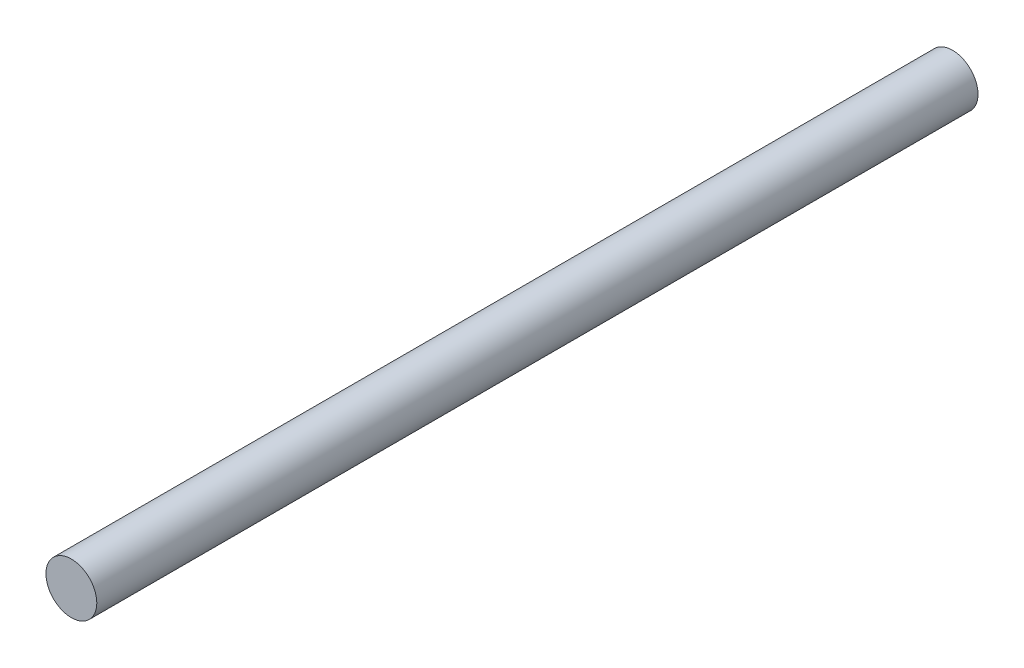
ISO-10303-21;
HEADER;
FILE_DESCRIPTION(('STEP AP214'),'2;1');
FILE_NAME('part.step','',(''),(''),'','','');
FILE_SCHEMA(('AUTOMOTIVE_DESIGN { 1 0 10303 214 1 1 1 1 }'));
ENDSEC;
DATA;
#1=APPLICATION_CONTEXT('core data for automotive mechanical design processes');
#2=APPLICATION_PROTOCOL_DEFINITION('international standard','automotive_design',2000,#1);
#3=PRODUCT_CONTEXT('',#1,'mechanical');
#4=PRODUCT('Part','Part','',(#3));
#5=PRODUCT_RELATED_PRODUCT_CATEGORY('part','',(#4));
#6=PRODUCT_DEFINITION_FORMATION('','',#4);
#7=PRODUCT_DEFINITION_CONTEXT('part definition',#1,'design');
#8=PRODUCT_DEFINITION('design','',#6,#7);
#9=PRODUCT_DEFINITION_SHAPE('','',#8);
#10=(LENGTH_UNIT() NAMED_UNIT(*) SI_UNIT(.MILLI.,.METRE.));
#11=(NAMED_UNIT(*) PLANE_ANGLE_UNIT() SI_UNIT($,.RADIAN.));
#12=(NAMED_UNIT(*) SI_UNIT($,.STERADIAN.) SOLID_ANGLE_UNIT());
#13=UNCERTAINTY_MEASURE_WITH_UNIT(LENGTH_MEASURE(1.E-05),#10,'distance_accuracy_value','');
#14=(GEOMETRIC_REPRESENTATION_CONTEXT(3) GLOBAL_UNCERTAINTY_ASSIGNED_CONTEXT((#13)) GLOBAL_UNIT_ASSIGNED_CONTEXT((#10,
#11,#12)) REPRESENTATION_CONTEXT('',''));
#15=CARTESIAN_POINT('',(0.,0.,0.));
#16=DIRECTION('',(0.,0.,1.));
#17=DIRECTION('',(1.,0.,0.));
#18=AXIS2_PLACEMENT_3D('',#15,#16,#17);
#19=CARTESIAN_POINT('',(0.,0.,82.55));
#20=DIRECTION('',(0.,0.,-1.));
#21=DIRECTION('',(-1.,0.,0.));
#22=AXIS2_PLACEMENT_3D('',#19,#20,#21);
#23=CYLINDRICAL_SURFACE('',#22,2.38125);
#24=CARTESIAN_POINT('',(0.,0.,82.55));
#25=DIRECTION('',(0.,0.,1.));
#26=DIRECTION('',(1.,0.,0.));
#27=AXIS2_PLACEMENT_3D('',#24,#25,#26);
#28=CIRCLE('',#27,2.38125);
#29=CARTESIAN_POINT('',(2.38125,0.,82.55));
#30=VERTEX_POINT('',#29);
#31=EDGE_CURVE('E10',#30,#30,#28,.T.);
#32=ORIENTED_EDGE('',*,*,#31,.F.);
#33=EDGE_LOOP('',(#32));
#34=FACE_BOUND('',#33,.T.);
#35=CARTESIAN_POINT('',(0.,0.,0.));
#36=DIRECTION('',(0.,0.,1.));
#37=DIRECTION('',(1.,0.,0.));
#38=AXIS2_PLACEMENT_3D('',#35,#36,#37);
#39=CIRCLE('',#38,2.38125);
#40=CARTESIAN_POINT('',(2.38125,0.,0.));
#41=VERTEX_POINT('',#40);
#42=EDGE_CURVE('E40',#41,#41,#39,.T.);
#43=ORIENTED_EDGE('',*,*,#42,.T.);
#44=EDGE_LOOP('',(#43));
#45=FACE_BOUND('',#44,.T.);
#46=ADVANCED_FACE('F37',(#34,#45),#23,.T.);
#47=CARTESIAN_POINT('',(0.,0.,82.55));
#48=DIRECTION('',(0.,0.,1.));
#49=DIRECTION('',(1.,0.,0.));
#50=AXIS2_PLACEMENT_3D('',#47,#48,#49);
#51=PLANE('',#50);
#52=ORIENTED_EDGE('',*,*,#31,.T.);
#53=EDGE_LOOP('',(#52));
#54=FACE_BOUND('',#53,.T.);
#55=ADVANCED_FACE('F54',(#54),#51,.T.);
#56=CARTESIAN_POINT('',(0.,0.,0.));
#57=DIRECTION('',(0.,0.,1.));
#58=DIRECTION('',(1.,0.,0.));
#59=AXIS2_PLACEMENT_3D('',#56,#57,#58);
#60=PLANE('',#59);
#61=ORIENTED_EDGE('',*,*,#42,.F.);
#62=EDGE_LOOP('',(#61));
#63=FACE_BOUND('',#62,.T.);
#64=ADVANCED_FACE('F52',(#63),#60,.F.);
#65=CLOSED_SHELL('',(#46,#55,#64));
#66=MANIFOLD_SOLID_BREP('B2',#65);
#67=ADVANCED_BREP_SHAPE_REPRESENTATION('',(#18,#66),#14);
#68=SHAPE_DEFINITION_REPRESENTATION(#9,#67);
ENDSEC;
END-ISO-10303-21;
